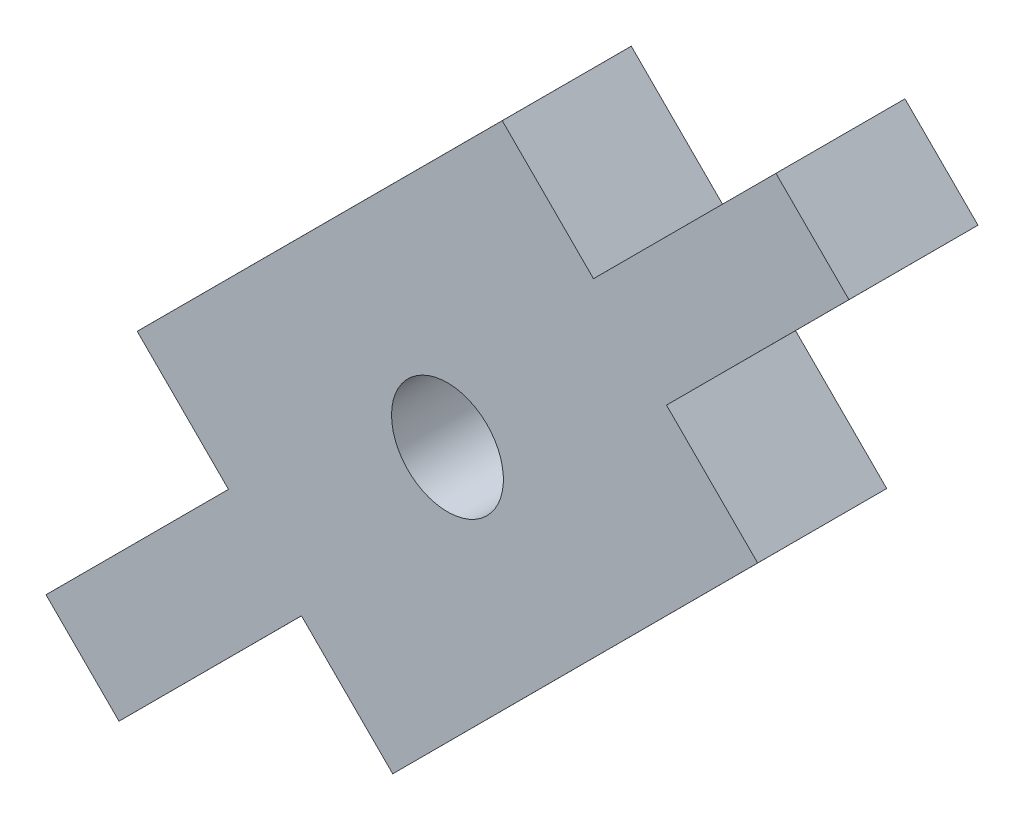
ISO-10303-21;
HEADER;
FILE_DESCRIPTION(('STEP AP214'),'2;1');
FILE_NAME('part.step','',(''),(''),'','','');
FILE_SCHEMA(('AUTOMOTIVE_DESIGN { 1 0 10303 214 1 1 1 1 }'));
ENDSEC;
DATA;
#1=APPLICATION_CONTEXT('core data for automotive mechanical design processes');
#2=APPLICATION_PROTOCOL_DEFINITION('international standard','automotive_design',2000,#1);
#3=PRODUCT_CONTEXT('',#1,'mechanical');
#4=PRODUCT('Part','Part','',(#3));
#5=PRODUCT_RELATED_PRODUCT_CATEGORY('part','',(#4));
#6=PRODUCT_DEFINITION_FORMATION('','',#4);
#7=PRODUCT_DEFINITION_CONTEXT('part definition',#1,'design');
#8=PRODUCT_DEFINITION('design','',#6,#7);
#9=PRODUCT_DEFINITION_SHAPE('','',#8);
#10=(LENGTH_UNIT() NAMED_UNIT(*) SI_UNIT(.MILLI.,.METRE.));
#11=(NAMED_UNIT(*) PLANE_ANGLE_UNIT() SI_UNIT($,.RADIAN.));
#12=(NAMED_UNIT(*) SI_UNIT($,.STERADIAN.) SOLID_ANGLE_UNIT());
#13=UNCERTAINTY_MEASURE_WITH_UNIT(LENGTH_MEASURE(1.E-05),#10,'distance_accuracy_value','');
#14=(GEOMETRIC_REPRESENTATION_CONTEXT(3) GLOBAL_UNCERTAINTY_ASSIGNED_CONTEXT((#13)) GLOBAL_UNIT_ASSIGNED_CONTEXT((#10,
#11,#12)) REPRESENTATION_CONTEXT('',''));
#15=CARTESIAN_POINT('',(0.,0.,0.));
#16=DIRECTION('',(0.,0.,1.));
#17=DIRECTION('',(1.,0.,0.));
#18=AXIS2_PLACEMENT_3D('',#15,#16,#17);
#19=CARTESIAN_POINT('',(4.81020438896918,29.8065772231633,-3.36285766749982));
#20=DIRECTION('',(-0.707018087801976,0.70719546344758,0.));
#21=DIRECTION('',(-0.70719546344758,-0.707018087801976,0.));
#22=AXIS2_PLACEMENT_3D('',#19,#20,#21);
#23=PLANE('',#22);
#24=DIRECTION('',(-0.70719546344758,-0.707018087801976,0.));
#25=VECTOR('',#24,1.);
#26=CARTESIAN_POINT('',(4.81020438896918,29.8065772231633,-0.36285766749983));
#27=LINE('',#26,#25);
#28=CARTESIAN_POINT('',(4.81020438896918,29.8065772231633,-0.36285766749983));
#29=VERTEX_POINT('',#28);
#30=CARTESIAN_POINT('',(-3.67629637528313,21.3222050055855,-0.36285766749983));
#31=VERTEX_POINT('',#30);
#32=EDGE_CURVE('E157',#29,#31,#27,.T.);
#33=ORIENTED_EDGE('',*,*,#32,.F.);
#34=DIRECTION('',(0.,0.,1.));
#35=VECTOR('',#34,1.);
#36=CARTESIAN_POINT('',(4.81020438896918,29.8065772231633,-3.36285766749982));
#37=LINE('',#36,#35);
#38=CARTESIAN_POINT('',(4.81020438896918,29.8065772231633,-3.36285766749982));
#39=VERTEX_POINT('',#38);
#40=EDGE_CURVE('E11',#39,#29,#37,.T.);
#41=ORIENTED_EDGE('',*,*,#40,.F.);
#42=DIRECTION('',(-0.70719546344758,-0.707018087801976,0.));
#43=VECTOR('',#42,1.);
#44=CARTESIAN_POINT('',(4.81020438896918,29.8065772231633,-3.36285766749982));
#45=LINE('',#44,#43);
#46=CARTESIAN_POINT('',(-3.67629637528313,21.3222050055855,-3.36285766749982));
#47=VERTEX_POINT('',#46);
#48=EDGE_CURVE('E190',#39,#47,#45,.T.);
#49=ORIENTED_EDGE('',*,*,#48,.T.);
#50=DIRECTION('',(0.,0.,1.));
#51=VECTOR('',#50,1.);
#52=CARTESIAN_POINT('',(-3.67629637528313,21.3222050055855,-3.36285766749982));
#53=LINE('',#52,#51);
#54=EDGE_CURVE('E39',#47,#31,#53,.T.);
#55=ORIENTED_EDGE('',*,*,#54,.T.);
#56=EDGE_LOOP('',(#33,#41,#49,#55));
#57=FACE_BOUND('',#56,.T.);
#58=ADVANCED_FACE('F36',(#57),#23,.T.);
#59=CARTESIAN_POINT('',(6.93196836559373,27.6854204138356,-3.36285766749982));
#60=DIRECTION('',(0.707005586078466,0.707207961814519,0.));
#61=DIRECTION('',(-0.707207961814519,0.707005586078466,0.));
#62=AXIS2_PLACEMENT_3D('',#59,#60,#61);
#63=PLANE('',#62);
#64=DIRECTION('',(-0.707207961814519,0.707005586078466,0.));
#65=VECTOR('',#64,1.);
#66=CARTESIAN_POINT('',(6.93196836559373,27.6854204138356,-0.36285766749983));
#67=LINE('',#66,#65);
#68=CARTESIAN_POINT('',(6.93196836559373,27.6854204138356,-0.36285766749983));
#69=VERTEX_POINT('',#68);
#70=EDGE_CURVE('E188',#69,#29,#67,.T.);
#71=ORIENTED_EDGE('',*,*,#70,.F.);
#72=DIRECTION('',(0.,0.,1.));
#73=VECTOR('',#72,1.);
#74=CARTESIAN_POINT('',(6.93196836559373,27.6854204138356,-3.36285766749982));
#75=LINE('',#74,#73);
#76=CARTESIAN_POINT('',(6.93196836559373,27.6854204138356,-3.36285766749982));
#77=VERTEX_POINT('',#76);
#78=EDGE_CURVE('E45',#77,#69,#75,.T.);
#79=ORIENTED_EDGE('',*,*,#78,.F.);
#80=DIRECTION('',(-0.707207961814519,0.707005586078466,0.));
#81=VECTOR('',#80,1.);
#82=CARTESIAN_POINT('',(6.93196836559373,27.6854204138356,-3.36285766749982));
#83=LINE('',#82,#81);
#84=EDGE_CURVE('E147',#77,#39,#83,.T.);
#85=ORIENTED_EDGE('',*,*,#84,.T.);
#86=ORIENTED_EDGE('',*,*,#40,.T.);
#87=EDGE_LOOP('',(#71,#79,#85,#86));
#88=FACE_BOUND('',#87,.T.);
#89=ADVANCED_FACE('F210',(#88),#63,.T.);
#90=CARTESIAN_POINT('',(11.1732462274371,31.9279123137941,-3.36285766749982));
#91=DIRECTION('',(-0.707207961814518,0.707005586078466,0.));
#92=DIRECTION('',(-0.707005586078466,-0.707207961814518,0.));
#93=AXIS2_PLACEMENT_3D('',#90,#91,#92);
#94=PLANE('',#93);
#95=DIRECTION('',(-0.707005586078466,-0.707207961814518,0.));
#96=VECTOR('',#95,1.);
#97=CARTESIAN_POINT('',(11.1732462274371,31.9279123137941,-0.36285766749983));
#98=LINE('',#97,#96);
#99=CARTESIAN_POINT('',(11.1732462274371,31.9279123137941,-0.36285766749983));
#100=VERTEX_POINT('',#99);
#101=EDGE_CURVE('E134',#100,#69,#98,.T.);
#102=ORIENTED_EDGE('',*,*,#101,.F.);
#103=DIRECTION('',(0.,0.,1.));
#104=VECTOR('',#103,1.);
#105=CARTESIAN_POINT('',(11.1732462274371,31.9279123137941,-3.36285766749982));
#106=LINE('',#105,#104);
#107=CARTESIAN_POINT('',(11.1732462274371,31.9279123137941,-3.36285766749982));
#108=VERTEX_POINT('',#107);
#109=EDGE_CURVE('E129',#108,#100,#106,.T.);
#110=ORIENTED_EDGE('',*,*,#109,.F.);
#111=DIRECTION('',(-0.707005586078466,-0.707207961814518,0.));
#112=VECTOR('',#111,1.);
#113=CARTESIAN_POINT('',(11.1732462274371,31.9279123137941,-3.36285766749982));
#114=LINE('',#113,#112);
#115=EDGE_CURVE('E132',#108,#77,#114,.T.);
#116=ORIENTED_EDGE('',*,*,#115,.T.);
#117=ORIENTED_EDGE('',*,*,#78,.T.);
#118=EDGE_LOOP('',(#102,#110,#116,#117));
#119=FACE_BOUND('',#118,.T.);
#120=ADVANCED_FACE('F131',(#119),#94,.T.);
#121=CARTESIAN_POINT('',(12.871430427799,30.2322173425028,-3.36285766749982));
#122=DIRECTION('',(0.706587966084029,0.707625215905451,0.));
#123=DIRECTION('',(-0.707625215905451,0.706587966084029,0.));
#124=AXIS2_PLACEMENT_3D('',#121,#122,#123);
#125=PLANE('',#124);
#126=DIRECTION('',(-0.707625215905451,0.706587966084029,0.));
#127=VECTOR('',#126,1.);
#128=CARTESIAN_POINT('',(12.871430427799,30.2322173425028,-0.36285766749983));
#129=LINE('',#128,#127);
#130=CARTESIAN_POINT('',(12.871430427799,30.2322173425028,-0.36285766749983));
#131=VERTEX_POINT('',#130);
#132=EDGE_CURVE('E185',#131,#100,#129,.T.);
#133=ORIENTED_EDGE('',*,*,#132,.F.);
#134=DIRECTION('',(0.,0.,1.));
#135=VECTOR('',#134,1.);
#136=CARTESIAN_POINT('',(12.871430427799,30.2322173425028,-3.36285766749982));
#137=LINE('',#136,#135);
#138=CARTESIAN_POINT('',(12.871430427799,30.2322173425028,-3.36285766749982));
#139=VERTEX_POINT('',#138);
#140=EDGE_CURVE('E139',#139,#131,#137,.T.);
#141=ORIENTED_EDGE('',*,*,#140,.F.);
#142=DIRECTION('',(-0.707625215905451,0.706587966084029,0.));
#143=VECTOR('',#142,1.);
#144=CARTESIAN_POINT('',(12.871430427799,30.2322173425028,-3.36285766749982));
#145=LINE('',#144,#143);
#146=EDGE_CURVE('E145',#139,#108,#145,.T.);
#147=ORIENTED_EDGE('',*,*,#146,.T.);
#148=ORIENTED_EDGE('',*,*,#109,.T.);
#149=EDGE_LOOP('',(#133,#141,#147,#148));
#150=FACE_BOUND('',#149,.T.);
#151=ADVANCED_FACE('F149',(#150),#125,.T.);
#152=CARTESIAN_POINT('',(8.62908040068235,25.9886529703708,-3.36285766749982));
#153=DIRECTION('',(0.707207961814509,-0.707005586078475,0.));
#154=DIRECTION('',(0.707005586078475,0.707207961814509,0.));
#155=AXIS2_PLACEMENT_3D('',#152,#153,#154);
#156=PLANE('',#155);
#157=DIRECTION('',(0.707005586078475,0.707207961814509,0.));
#158=VECTOR('',#157,1.);
#159=CARTESIAN_POINT('',(8.62908040068235,25.9886529703708,-0.36285766749983));
#160=LINE('',#159,#158);
#161=CARTESIAN_POINT('',(8.62908040068235,25.9886529703708,-0.36285766749983));
#162=VERTEX_POINT('',#161);
#163=EDGE_CURVE('E182',#162,#131,#160,.T.);
#164=ORIENTED_EDGE('',*,*,#163,.F.);
#165=DIRECTION('',(0.,0.,1.));
#166=VECTOR('',#165,1.);
#167=CARTESIAN_POINT('',(8.62908040068235,25.9886529703708,-3.36285766749982));
#168=LINE('',#167,#166);
#169=CARTESIAN_POINT('',(8.62908040068235,25.9886529703708,-3.36285766749982));
#170=VERTEX_POINT('',#169);
#171=EDGE_CURVE('E194',#170,#162,#168,.T.);
#172=ORIENTED_EDGE('',*,*,#171,.F.);
#173=DIRECTION('',(0.707005586078475,0.707207961814509,0.));
#174=VECTOR('',#173,1.);
#175=CARTESIAN_POINT('',(8.62908040068235,25.9886529703708,-3.36285766749982));
#176=LINE('',#175,#174);
#177=EDGE_CURVE('E150',#170,#139,#176,.T.);
#178=ORIENTED_EDGE('',*,*,#177,.T.);
#179=ORIENTED_EDGE('',*,*,#140,.T.);
#180=EDGE_LOOP('',(#164,#172,#178,#179));
#181=FACE_BOUND('',#180,.T.);
#182=ADVANCED_FACE('F223',(#181),#156,.T.);
#183=CARTESIAN_POINT('',(10.749072595093,23.869267436241,-3.36285766749982));
#184=DIRECTION('',(0.707005586078482,0.707207961814502,0.));
#185=DIRECTION('',(-0.707207961814502,0.707005586078482,0.));
#186=AXIS2_PLACEMENT_3D('',#183,#184,#185);
#187=PLANE('',#186);
#188=DIRECTION('',(-0.707207961814502,0.707005586078482,0.));
#189=VECTOR('',#188,1.);
#190=CARTESIAN_POINT('',(10.749072595093,23.869267436241,-0.36285766749983));
#191=LINE('',#190,#189);
#192=CARTESIAN_POINT('',(10.749072595093,23.869267436241,-0.36285766749983));
#193=VERTEX_POINT('',#192);
#194=EDGE_CURVE('E179',#193,#162,#191,.T.);
#195=ORIENTED_EDGE('',*,*,#194,.F.);
#196=DIRECTION('',(0.,0.,1.));
#197=VECTOR('',#196,1.);
#198=CARTESIAN_POINT('',(10.749072595093,23.869267436241,-3.36285766749982));
#199=LINE('',#198,#197);
#200=CARTESIAN_POINT('',(10.749072595093,23.869267436241,-3.36285766749982));
#201=VERTEX_POINT('',#200);
#202=EDGE_CURVE('E196',#201,#193,#199,.T.);
#203=ORIENTED_EDGE('',*,*,#202,.F.);
#204=DIRECTION('',(-0.707207961814502,0.707005586078482,0.));
#205=VECTOR('',#204,1.);
#206=CARTESIAN_POINT('',(10.749072595093,23.869267436241,-3.36285766749982));
#207=LINE('',#206,#205);
#208=EDGE_CURVE('E152',#201,#170,#207,.T.);
#209=ORIENTED_EDGE('',*,*,#208,.T.);
#210=ORIENTED_EDGE('',*,*,#171,.T.);
#211=EDGE_LOOP('',(#195,#203,#209,#210));
#212=FACE_BOUND('',#211,.T.);
#213=ADVANCED_FACE('F226',(#212),#187,.T.);
#214=CARTESIAN_POINT('',(2.26429440442371,15.3820605331749,-3.36285766749982));
#215=DIRECTION('',(0.707207961814512,-0.707005586078473,0.));
#216=DIRECTION('',(0.707005586078473,0.707207961814512,0.));
#217=AXIS2_PLACEMENT_3D('',#214,#215,#216);
#218=PLANE('',#217);
#219=DIRECTION('',(0.707005586078472,0.707207961814512,0.));
#220=VECTOR('',#219,1.);
#221=CARTESIAN_POINT('',(2.26429440442371,15.3820605331749,-0.36285766749983));
#222=LINE('',#221,#220);
#223=CARTESIAN_POINT('',(2.26429440442371,15.3820605331749,-0.36285766749983));
#224=VERTEX_POINT('',#223);
#225=EDGE_CURVE('E176',#224,#193,#222,.T.);
#226=ORIENTED_EDGE('',*,*,#225,.F.);
#227=DIRECTION('',(0.,0.,1.));
#228=VECTOR('',#227,1.);
#229=CARTESIAN_POINT('',(2.26429440442371,15.3820605331749,-3.36285766749982));
#230=LINE('',#229,#228);
#231=CARTESIAN_POINT('',(2.26429440442371,15.3820605331749,-3.36285766749982));
#232=VERTEX_POINT('',#231);
#233=EDGE_CURVE('E198',#232,#224,#230,.T.);
#234=ORIENTED_EDGE('',*,*,#233,.F.);
#235=DIRECTION('',(0.707005586078472,0.707207961814512,0.));
#236=VECTOR('',#235,1.);
#237=CARTESIAN_POINT('',(2.26429440442371,15.3820605331749,-3.36285766749982));
#238=LINE('',#237,#236);
#239=EDGE_CURVE('E289',#232,#201,#238,.T.);
#240=ORIENTED_EDGE('',*,*,#239,.T.);
#241=ORIENTED_EDGE('',*,*,#202,.T.);
#242=EDGE_LOOP('',(#226,#234,#240,#241));
#243=FACE_BOUND('',#242,.T.);
#244=ADVANCED_FACE('F230',(#243),#218,.T.);
#245=CARTESIAN_POINT('',(0.142530427799182,17.5032173425026,-3.36285766749982));
#246=DIRECTION('',(-0.707005586078476,-0.707207961814509,0.));
#247=DIRECTION('',(0.707207961814509,-0.707005586078476,0.));
#248=AXIS2_PLACEMENT_3D('',#245,#246,#247);
#249=PLANE('',#248);
#250=DIRECTION('',(0.707207961814509,-0.707005586078475,0.));
#251=VECTOR('',#250,1.);
#252=CARTESIAN_POINT('',(0.142530427799182,17.5032173425026,-0.36285766749983));
#253=LINE('',#252,#251);
#254=CARTESIAN_POINT('',(0.142530427799182,17.5032173425026,-0.36285766749983));
#255=VERTEX_POINT('',#254);
#256=EDGE_CURVE('E173',#255,#224,#253,.T.);
#257=ORIENTED_EDGE('',*,*,#256,.F.);
#258=DIRECTION('',(0.,0.,1.));
#259=VECTOR('',#258,1.);
#260=CARTESIAN_POINT('',(0.142530427799182,17.5032173425026,-3.36285766749982));
#261=LINE('',#260,#259);
#262=CARTESIAN_POINT('',(0.142530427799182,17.5032173425026,-3.36285766749982));
#263=VERTEX_POINT('',#262);
#264=EDGE_CURVE('E200',#263,#255,#261,.T.);
#265=ORIENTED_EDGE('',*,*,#264,.F.);
#266=DIRECTION('',(0.707207961814509,-0.707005586078475,0.));
#267=VECTOR('',#266,1.);
#268=CARTESIAN_POINT('',(0.142530427799182,17.5032173425026,-3.36285766749982));
#269=LINE('',#268,#267);
#270=EDGE_CURVE('E286',#263,#232,#269,.T.);
#271=ORIENTED_EDGE('',*,*,#270,.T.);
#272=ORIENTED_EDGE('',*,*,#233,.T.);
#273=EDGE_LOOP('',(#257,#265,#271,#272));
#274=FACE_BOUND('',#273,.T.);
#275=ADVANCED_FACE('F234',(#274),#249,.T.);
#276=CARTESIAN_POINT('',(-4.09981959931748,13.2596529703707,-3.36285766749982));
#277=DIRECTION('',(0.707207961814509,-0.707005586078475,0.));
#278=DIRECTION('',(0.707005586078475,0.707207961814509,0.));
#279=AXIS2_PLACEMENT_3D('',#276,#277,#278);
#280=PLANE('',#279);
#281=DIRECTION('',(0.707005586078475,0.707207961814509,0.));
#282=VECTOR('',#281,1.);
#283=CARTESIAN_POINT('',(-4.09981959931748,13.2596529703707,-0.36285766749983));
#284=LINE('',#283,#282);
#285=CARTESIAN_POINT('',(-4.09981959931748,13.2596529703707,-0.36285766749983));
#286=VERTEX_POINT('',#285);
#287=EDGE_CURVE('E170',#286,#255,#284,.T.);
#288=ORIENTED_EDGE('',*,*,#287,.F.);
#289=DIRECTION('',(0.,0.,1.));
#290=VECTOR('',#289,1.);
#291=CARTESIAN_POINT('',(-4.09981959931748,13.2596529703707,-3.36285766749982));
#292=LINE('',#291,#290);
#293=CARTESIAN_POINT('',(-4.09981959931748,13.2596529703707,-3.36285766749982));
#294=VERTEX_POINT('',#293);
#295=EDGE_CURVE('E202',#294,#286,#292,.T.);
#296=ORIENTED_EDGE('',*,*,#295,.F.);
#297=DIRECTION('',(0.707005586078475,0.707207961814509,0.));
#298=VECTOR('',#297,1.);
#299=CARTESIAN_POINT('',(-4.09981959931748,13.2596529703707,-3.36285766749982));
#300=LINE('',#299,#298);
#301=EDGE_CURVE('E283',#294,#263,#300,.T.);
#302=ORIENTED_EDGE('',*,*,#301,.T.);
#303=ORIENTED_EDGE('',*,*,#264,.T.);
#304=EDGE_LOOP('',(#288,#296,#302,#303));
#305=FACE_BOUND('',#304,.T.);
#306=ADVANCED_FACE('F238',(#305),#280,.T.);
#307=CARTESIAN_POINT('',(-5.79688242577524,14.9574838241258,-3.36285766749982));
#308=DIRECTION('',(-0.707266731958833,-0.706946794224483,0.));
#309=DIRECTION('',(0.706946794224483,-0.707266731958833,0.));
#310=AXIS2_PLACEMENT_3D('',#307,#308,#309);
#311=PLANE('',#310);
#312=DIRECTION('',(0.706946794224482,-0.707266731958832,0.));
#313=VECTOR('',#312,1.);
#314=CARTESIAN_POINT('',(-5.79688242577524,14.9574838241258,-0.36285766749983));
#315=LINE('',#314,#313);
#316=CARTESIAN_POINT('',(-5.79688242577524,14.9574838241258,-0.36285766749983));
#317=VERTEX_POINT('',#316);
#318=EDGE_CURVE('E167',#317,#286,#315,.T.);
#319=ORIENTED_EDGE('',*,*,#318,.F.);
#320=DIRECTION('',(0.,0.,1.));
#321=VECTOR('',#320,1.);
#322=CARTESIAN_POINT('',(-5.79688242577524,14.9574838241258,-3.36285766749982));
#323=LINE('',#322,#321);
#324=CARTESIAN_POINT('',(-5.79688242577524,14.9574838241258,-3.36285766749982));
#325=VERTEX_POINT('',#324);
#326=EDGE_CURVE('E204',#325,#317,#323,.T.);
#327=ORIENTED_EDGE('',*,*,#326,.F.);
#328=DIRECTION('',(0.706946794224482,-0.707266731958832,0.));
#329=VECTOR('',#328,1.);
#330=CARTESIAN_POINT('',(-5.79688242577524,14.9574838241258,-3.36285766749982));
#331=LINE('',#330,#329);
#332=EDGE_CURVE('E280',#325,#294,#331,.T.);
#333=ORIENTED_EDGE('',*,*,#332,.T.);
#334=ORIENTED_EDGE('',*,*,#295,.T.);
#335=EDGE_LOOP('',(#319,#327,#333,#334));
#336=FACE_BOUND('',#335,.T.);
#337=ADVANCED_FACE('F242',(#336),#311,.T.);
#338=CARTESIAN_POINT('',(-1.55453239865857,19.2010481962578,-3.36285766749982));
#339=DIRECTION('',(-0.707207961814511,0.707005586078473,0.));
#340=DIRECTION('',(-0.707005586078474,-0.707207961814511,0.));
#341=AXIS2_PLACEMENT_3D('',#338,#339,#340);
#342=PLANE('',#341);
#343=DIRECTION('',(-0.707005586078474,-0.707207961814511,0.));
#344=VECTOR('',#343,1.);
#345=CARTESIAN_POINT('',(-1.55453239865857,19.2010481962578,-0.36285766749983));
#346=LINE('',#345,#344);
#347=CARTESIAN_POINT('',(-1.55453239865857,19.2010481962578,-0.36285766749983));
#348=VERTEX_POINT('',#347);
#349=EDGE_CURVE('E164',#348,#317,#346,.T.);
#350=ORIENTED_EDGE('',*,*,#349,.F.);
#351=DIRECTION('',(0.,0.,1.));
#352=VECTOR('',#351,1.);
#353=CARTESIAN_POINT('',(-1.55453239865857,19.2010481962578,-3.36285766749982));
#354=LINE('',#353,#352);
#355=CARTESIAN_POINT('',(-1.55453239865857,19.2010481962578,-3.36285766749982));
#356=VERTEX_POINT('',#355);
#357=EDGE_CURVE('E205',#356,#348,#354,.T.);
#358=ORIENTED_EDGE('',*,*,#357,.F.);
#359=DIRECTION('',(-0.707005586078474,-0.707207961814511,0.));
#360=VECTOR('',#359,1.);
#361=CARTESIAN_POINT('',(-1.55453239865857,19.2010481962578,-3.36285766749982));
#362=LINE('',#361,#360);
#363=EDGE_CURVE('E277',#356,#325,#362,.T.);
#364=ORIENTED_EDGE('',*,*,#363,.T.);
#365=ORIENTED_EDGE('',*,*,#326,.T.);
#366=EDGE_LOOP('',(#350,#358,#364,#365));
#367=FACE_BOUND('',#366,.T.);
#368=ADVANCED_FACE('F246',(#367),#342,.T.);
#369=CARTESIAN_POINT('',(-3.67629637528313,21.3222050055855,-3.36285766749982));
#370=DIRECTION('',(-0.707005586078473,-0.707207961814511,0.));
#371=DIRECTION('',(0.707207961814511,-0.707005586078473,0.));
#372=AXIS2_PLACEMENT_3D('',#369,#370,#371);
#373=PLANE('',#372);
#374=DIRECTION('',(0.707207961814511,-0.707005586078473,0.));
#375=VECTOR('',#374,1.);
#376=CARTESIAN_POINT('',(-3.67629637528313,21.3222050055855,-0.36285766749983));
#377=LINE('',#376,#375);
#378=EDGE_CURVE('E160',#31,#348,#377,.T.);
#379=ORIENTED_EDGE('',*,*,#378,.F.);
#380=ORIENTED_EDGE('',*,*,#54,.F.);
#381=DIRECTION('',(0.707207961814511,-0.707005586078473,0.));
#382=VECTOR('',#381,1.);
#383=CARTESIAN_POINT('',(-3.67629637528313,21.3222050055855,-3.36285766749982));
#384=LINE('',#383,#382);
#385=EDGE_CURVE('E275',#47,#356,#384,.T.);
#386=ORIENTED_EDGE('',*,*,#385,.T.);
#387=ORIENTED_EDGE('',*,*,#357,.T.);
#388=EDGE_LOOP('',(#379,#380,#386,#387));
#389=FACE_BOUND('',#388,.T.);
#390=ADVANCED_FACE('F207',(#389),#373,.T.);
#391=CARTESIAN_POINT('',(0.,0.,-3.36285766749982));
#392=DIRECTION('',(0.,0.,1.));
#393=DIRECTION('',(1.,0.,0.));
#394=AXIS2_PLACEMENT_3D('',#391,#392,#393);
#395=PLANE('',#394);
#396=CARTESIAN_POINT('',(3.53656757422475,22.5939838241258,-3.36285766749982));
#397=DIRECTION('',(0.,0.,1.));
#398=DIRECTION('',(-1.,0.,0.));
#399=AXIS2_PLACEMENT_3D('',#396,#397,#398);
#400=CIRCLE('',#399,1.3);
#401=CARTESIAN_POINT('',(2.23656757422475,22.5939838241258,-3.36285766749982));
#402=VERTEX_POINT('',#401);
#403=EDGE_CURVE('E161',#402,#402,#400,.T.);
#404=ORIENTED_EDGE('',*,*,#403,.T.);
#405=EDGE_LOOP('',(#404));
#406=FACE_BOUND('',#405,.T.);
#407=ORIENTED_EDGE('',*,*,#48,.F.);
#408=ORIENTED_EDGE('',*,*,#84,.F.);
#409=ORIENTED_EDGE('',*,*,#115,.F.);
#410=ORIENTED_EDGE('',*,*,#146,.F.);
#411=ORIENTED_EDGE('',*,*,#177,.F.);
#412=ORIENTED_EDGE('',*,*,#208,.F.);
#413=ORIENTED_EDGE('',*,*,#239,.F.);
#414=ORIENTED_EDGE('',*,*,#270,.F.);
#415=ORIENTED_EDGE('',*,*,#301,.F.);
#416=ORIENTED_EDGE('',*,*,#332,.F.);
#417=ORIENTED_EDGE('',*,*,#363,.F.);
#418=ORIENTED_EDGE('',*,*,#385,.F.);
#419=EDGE_LOOP('',(#407,#408,#409,#410,#411,#412,#413,#414,#415,#416,#417,#418));
#420=FACE_BOUND('',#419,.T.);
#421=ADVANCED_FACE('F143',(#406,#420),#395,.F.);
#422=CARTESIAN_POINT('',(0.,0.,-0.36285766749983));
#423=DIRECTION('',(0.,0.,1.));
#424=DIRECTION('',(1.,0.,0.));
#425=AXIS2_PLACEMENT_3D('',#422,#423,#424);
#426=PLANE('',#425);
#427=CARTESIAN_POINT('',(3.53656757422475,22.5939838241258,-0.36285766749983));
#428=DIRECTION('',(0.,0.,1.));
#429=DIRECTION('',(-1.,0.,0.));
#430=AXIS2_PLACEMENT_3D('',#427,#428,#429);
#431=CIRCLE('',#430,1.3);
#432=CARTESIAN_POINT('',(2.23656757422475,22.5939838241258,-0.36285766749983));
#433=VERTEX_POINT('',#432);
#434=EDGE_CURVE('E270',#433,#433,#431,.T.);
#435=ORIENTED_EDGE('',*,*,#434,.F.);
#436=EDGE_LOOP('',(#435));
#437=FACE_BOUND('',#436,.T.);
#438=ORIENTED_EDGE('',*,*,#32,.T.);
#439=ORIENTED_EDGE('',*,*,#378,.T.);
#440=ORIENTED_EDGE('',*,*,#349,.T.);
#441=ORIENTED_EDGE('',*,*,#318,.T.);
#442=ORIENTED_EDGE('',*,*,#287,.T.);
#443=ORIENTED_EDGE('',*,*,#256,.T.);
#444=ORIENTED_EDGE('',*,*,#225,.T.);
#445=ORIENTED_EDGE('',*,*,#194,.T.);
#446=ORIENTED_EDGE('',*,*,#163,.T.);
#447=ORIENTED_EDGE('',*,*,#132,.T.);
#448=ORIENTED_EDGE('',*,*,#101,.T.);
#449=ORIENTED_EDGE('',*,*,#70,.T.);
#450=EDGE_LOOP('',(#438,#439,#440,#441,#442,#443,#444,#445,#446,#447,#448,#449));
#451=FACE_BOUND('',#450,.T.);
#452=ADVANCED_FACE('F209',(#437,#451),#426,.T.);
#453=CARTESIAN_POINT('',(3.53656757422475,22.5939838241258,-3.36285766749982));
#454=DIRECTION('',(0.,0.,1.));
#455=DIRECTION('',(1.,0.,0.));
#456=AXIS2_PLACEMENT_3D('',#453,#454,#455);
#457=CYLINDRICAL_SURFACE('',#456,1.3);
#458=ORIENTED_EDGE('',*,*,#403,.F.);
#459=EDGE_LOOP('',(#458));
#460=FACE_BOUND('',#459,.T.);
#461=ORIENTED_EDGE('',*,*,#434,.T.);
#462=EDGE_LOOP('',(#461));
#463=FACE_BOUND('',#462,.T.);
#464=ADVANCED_FACE('F258',(#460,#463),#457,.F.);
#465=CLOSED_SHELL('',(#58,#89,#120,#151,#182,#213,#244,#275,#306,#337,#368,#390,#421,#452,#464));
#466=MANIFOLD_SOLID_BREP('B2',#465);
#467=ADVANCED_BREP_SHAPE_REPRESENTATION('',(#18,#466),#14);
#468=SHAPE_DEFINITION_REPRESENTATION(#9,#467);
ENDSEC;
END-ISO-10303-21;
